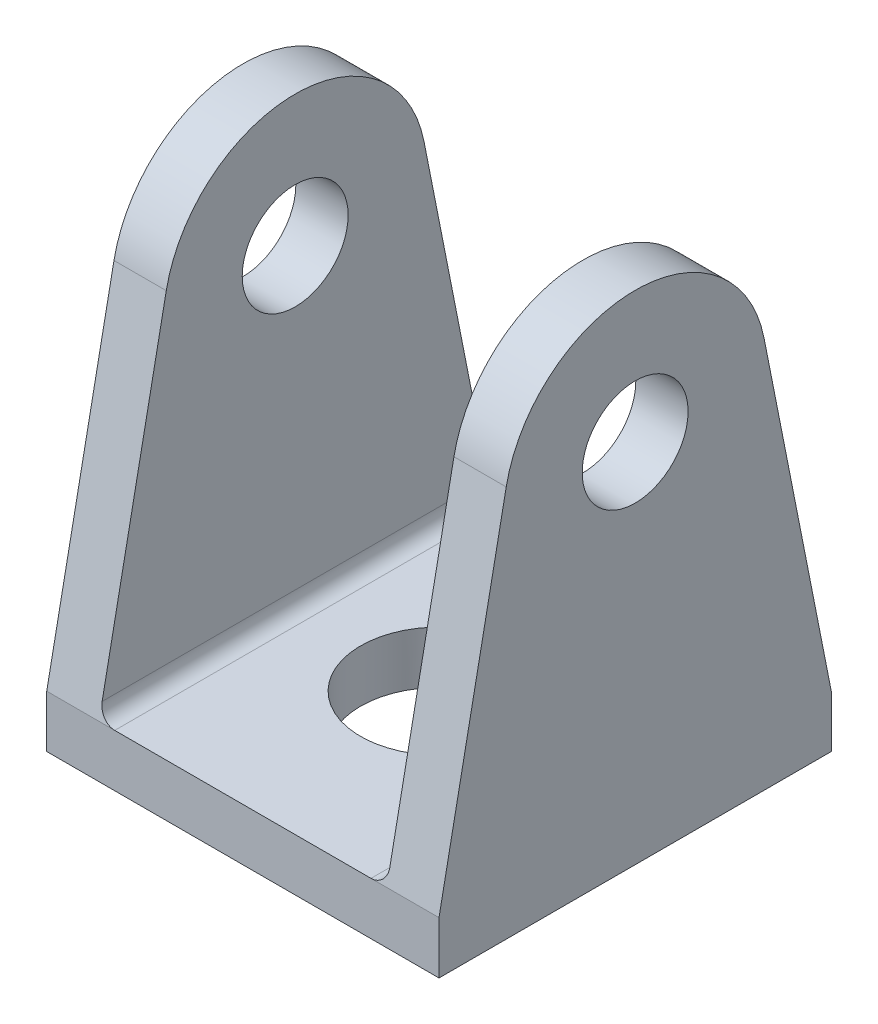
ISO-10303-21;
HEADER;
FILE_DESCRIPTION(('STEP AP214'),'2;1');
FILE_NAME('part.step','',(''),(''),'','','');
FILE_SCHEMA(('AUTOMOTIVE_DESIGN { 1 0 10303 214 1 1 1 1 }'));
ENDSEC;
DATA;
#1=APPLICATION_CONTEXT('core data for automotive mechanical design processes');
#2=APPLICATION_PROTOCOL_DEFINITION('international standard','automotive_design',2000,#1);
#3=PRODUCT_CONTEXT('',#1,'mechanical');
#4=PRODUCT('Part','Part','',(#3));
#5=PRODUCT_RELATED_PRODUCT_CATEGORY('part','',(#4));
#6=PRODUCT_DEFINITION_FORMATION('','',#4);
#7=PRODUCT_DEFINITION_CONTEXT('part definition',#1,'design');
#8=PRODUCT_DEFINITION('design','',#6,#7);
#9=PRODUCT_DEFINITION_SHAPE('','',#8);
#10=(LENGTH_UNIT() NAMED_UNIT(*) SI_UNIT(.MILLI.,.METRE.));
#11=(NAMED_UNIT(*) PLANE_ANGLE_UNIT() SI_UNIT($,.RADIAN.));
#12=(NAMED_UNIT(*) SI_UNIT($,.STERADIAN.) SOLID_ANGLE_UNIT());
#13=UNCERTAINTY_MEASURE_WITH_UNIT(LENGTH_MEASURE(1.E-05),#10,'distance_accuracy_value','');
#14=(GEOMETRIC_REPRESENTATION_CONTEXT(3) GLOBAL_UNCERTAINTY_ASSIGNED_CONTEXT((#13)) GLOBAL_UNIT_ASSIGNED_CONTEXT((#10,
#11,#12)) REPRESENTATION_CONTEXT('',''));
#15=CARTESIAN_POINT('',(0.,0.,0.));
#16=DIRECTION('',(0.,0.,1.));
#17=DIRECTION('',(1.,0.,0.));
#18=AXIS2_PLACEMENT_3D('',#15,#16,#17);
#19=CARTESIAN_POINT('',(-113.451600363327,74.8826559898735,-62.1459995837976));
#20=DIRECTION('',(0.,0.194334566761134,-0.980935306817816));
#21=DIRECTION('',(0.,0.980935306817816,0.194334566761134));
#22=AXIS2_PLACEMENT_3D('',#19,#20,#21);
#23=PLANE('',#22);
#24=DIRECTION('',(0.,0.980935306817816,0.194334566761134));
#25=VECTOR('',#24,1.);
#26=CARTESIAN_POINT('',(9.99999999999999,74.8826559898735,-62.1459995837976));
#27=LINE('',#26,#25);
#28=CARTESIAN_POINT('',(9.99999999999999,13.,-74.405665494726));
#29=VERTEX_POINT('',#28);
#30=CARTESIAN_POINT('',(9.99999999999999,74.8826559898735,-62.1459995837976));
#31=VERTEX_POINT('',#30);
#32=EDGE_CURVE('E98',#29,#31,#27,.T.);
#33=ORIENTED_EDGE('',*,*,#32,.F.);
#34=CARTESIAN_POINT('',(13.,13.,-74.405665494726));
#35=DIRECTION('',(0.,0.194334566761134,-0.980935306817816));
#36=DIRECTION('',(0.,-0.980935306817816,-0.194334566761134));
#37=AXIS2_PLACEMENT_3D('',#34,#35,#36);
#38=ELLIPSE('',#37,3.05830565904707,3.);
#39=CARTESIAN_POINT('',(13.,10.,-75.));
#40=VERTEX_POINT('',#39);
#41=EDGE_CURVE('E11',#29,#40,#38,.F.);
#42=ORIENTED_EDGE('',*,*,#41,.T.);
#43=DIRECTION('',(-1.,0.,0.));
#44=VECTOR('',#43,1.);
#45=CARTESIAN_POINT('',(0.,10.,-75.));
#46=LINE('',#45,#44);
#47=CARTESIAN_POINT('',(0.,9.99999999999998,-75.));
#48=VERTEX_POINT('',#47);
#49=EDGE_CURVE('E48',#40,#48,#46,.T.);
#50=ORIENTED_EDGE('',*,*,#49,.T.);
#51=DIRECTION('',(0.,-0.980935306817816,-0.194334566761134));
#52=VECTOR('',#51,1.);
#53=CARTESIAN_POINT('',(0.,74.8826559898735,-62.1459995837976));
#54=LINE('',#53,#52);
#55=CARTESIAN_POINT('',(0.,74.8826559898735,-62.1459995837976));
#56=VERTEX_POINT('',#55);
#57=EDGE_CURVE('E158',#56,#48,#54,.T.);
#58=ORIENTED_EDGE('',*,*,#57,.F.);
#59=DIRECTION('',(1.,0.,0.));
#60=VECTOR('',#59,1.);
#61=CARTESIAN_POINT('',(-113.451600363327,74.8826559898735,-62.1459995837976));
#62=LINE('',#61,#60);
#63=EDGE_CURVE('E111',#56,#31,#62,.T.);
#64=ORIENTED_EDGE('',*,*,#63,.T.);
#65=EDGE_LOOP('',(#33,#42,#50,#58,#64));
#66=FACE_BOUND('',#65,.T.);
#67=ADVANCED_FACE('F33',(#66),#23,.T.);
#68=CARTESIAN_POINT('',(-113.451600363327,70.,-37.5));
#69=DIRECTION('',(1.,0.,0.));
#70=DIRECTION('',(0.,0.,-1.));
#71=AXIS2_PLACEMENT_3D('',#68,#69,#70);
#72=CYLINDRICAL_SURFACE('',#71,25.125);
#73=CARTESIAN_POINT('',(9.99999999999999,70.,-37.5));
#74=DIRECTION('',(-1.,0.,0.));
#75=DIRECTION('',(0.,0.,1.));
#76=AXIS2_PLACEMENT_3D('',#73,#74,#75);
#77=CIRCLE('',#76,25.125);
#78=CARTESIAN_POINT('',(9.99999999999999,74.8826559898735,-12.8540004162024));
#79=VERTEX_POINT('',#78);
#80=EDGE_CURVE('E113',#31,#79,#77,.F.);
#81=ORIENTED_EDGE('',*,*,#80,.F.);
#82=ORIENTED_EDGE('',*,*,#63,.F.);
#83=CARTESIAN_POINT('',(0.,70.,-37.5));
#84=DIRECTION('',(1.,0.,0.));
#85=DIRECTION('',(0.,0.,-1.));
#86=AXIS2_PLACEMENT_3D('',#83,#84,#85);
#87=CIRCLE('',#86,25.125);
#88=CARTESIAN_POINT('',(0.,74.8826559898735,-12.8540004162024));
#89=VERTEX_POINT('',#88);
#90=EDGE_CURVE('E142',#89,#56,#87,.F.);
#91=ORIENTED_EDGE('',*,*,#90,.F.);
#92=DIRECTION('',(1.,0.,0.));
#93=VECTOR('',#92,1.);
#94=CARTESIAN_POINT('',(-113.451600363327,74.8826559898735,-12.8540004162024));
#95=LINE('',#94,#93);
#96=EDGE_CURVE('E133',#89,#79,#95,.T.);
#97=ORIENTED_EDGE('',*,*,#96,.T.);
#98=EDGE_LOOP('',(#81,#82,#91,#97));
#99=FACE_BOUND('',#98,.T.);
#100=ADVANCED_FACE('F140',(#99),#72,.T.);
#101=CARTESIAN_POINT('',(-113.451600363327,10.,0.));
#102=DIRECTION('',(0.,0.194334566761134,0.980935306817816));
#103=DIRECTION('',(0.,-0.980935306817816,0.194334566761134));
#104=AXIS2_PLACEMENT_3D('',#101,#102,#103);
#105=PLANE('',#104);
#106=DIRECTION('',(0.,-0.980935306817816,0.194334566761134));
#107=VECTOR('',#106,1.);
#108=CARTESIAN_POINT('',(9.99999999999999,10.,0.));
#109=LINE('',#108,#107);
#110=CARTESIAN_POINT('',(9.99999999999999,13.,-0.594334505274052));
#111=VERTEX_POINT('',#110);
#112=EDGE_CURVE('E101',#79,#111,#109,.T.);
#113=ORIENTED_EDGE('',*,*,#112,.F.);
#114=ORIENTED_EDGE('',*,*,#96,.F.);
#115=DIRECTION('',(0.,0.980935306817816,-0.194334566761134));
#116=VECTOR('',#115,1.);
#117=CARTESIAN_POINT('',(0.,10.,0.));
#118=LINE('',#117,#116);
#119=CARTESIAN_POINT('',(0.,10.,0.));
#120=VERTEX_POINT('',#119);
#121=EDGE_CURVE('E145',#120,#89,#118,.T.);
#122=ORIENTED_EDGE('',*,*,#121,.F.);
#123=DIRECTION('',(1.,0.,0.));
#124=VECTOR('',#123,1.);
#125=CARTESIAN_POINT('',(0.,10.,0.));
#126=LINE('',#125,#124);
#127=CARTESIAN_POINT('',(13.,10.,0.));
#128=VERTEX_POINT('',#127);
#129=EDGE_CURVE('E72',#120,#128,#126,.T.);
#130=ORIENTED_EDGE('',*,*,#129,.T.);
#131=CARTESIAN_POINT('',(13.,13.,-0.594334505274061));
#132=DIRECTION('',(0.,0.194334566761134,0.980935306817816));
#133=DIRECTION('',(0.,0.980935306817816,-0.194334566761134));
#134=AXIS2_PLACEMENT_3D('',#131,#132,#133);
#135=ELLIPSE('',#134,3.05830565904707,3.);
#136=EDGE_CURVE('E41',#128,#111,#135,.F.);
#137=ORIENTED_EDGE('',*,*,#136,.T.);
#138=EDGE_LOOP('',(#113,#114,#122,#130,#137));
#139=FACE_BOUND('',#138,.T.);
#140=ADVANCED_FACE('F128',(#139),#105,.T.);
#141=CARTESIAN_POINT('',(-113.451600363327,70.,-37.5));
#142=DIRECTION('',(1.,0.,0.));
#143=DIRECTION('',(0.,0.,-1.));
#144=AXIS2_PLACEMENT_3D('',#141,#142,#143);
#145=CYLINDRICAL_SURFACE('',#144,10.125);
#146=CARTESIAN_POINT('',(9.99999999999999,70.,-37.5));
#147=DIRECTION('',(-1.,0.,0.));
#148=DIRECTION('',(0.,0.,1.));
#149=AXIS2_PLACEMENT_3D('',#146,#147,#148);
#150=CIRCLE('',#149,10.125);
#151=CARTESIAN_POINT('',(9.99999999999999,70.,-27.375));
#152=VERTEX_POINT('',#151);
#153=EDGE_CURVE('E136',#152,#152,#150,.F.);
#154=ORIENTED_EDGE('',*,*,#153,.T.);
#155=EDGE_LOOP('',(#154));
#156=FACE_BOUND('',#155,.T.);
#157=CARTESIAN_POINT('',(0.,70.,-37.5));
#158=DIRECTION('',(1.,0.,0.));
#159=DIRECTION('',(0.,0.,-1.));
#160=AXIS2_PLACEMENT_3D('',#157,#158,#159);
#161=CIRCLE('',#160,10.125);
#162=CARTESIAN_POINT('',(0.,70.,-47.625));
#163=VERTEX_POINT('',#162);
#164=EDGE_CURVE('E154',#163,#163,#161,.F.);
#165=ORIENTED_EDGE('',*,*,#164,.T.);
#166=EDGE_LOOP('',(#165));
#167=FACE_BOUND('',#166,.T.);
#168=ADVANCED_FACE('F315',(#156,#167),#145,.F.);
#169=CARTESIAN_POINT('',(0.,0.,0.));
#170=DIRECTION('',(0.,-1.,0.));
#171=DIRECTION('',(0.,0.,-1.));
#172=AXIS2_PLACEMENT_3D('',#169,#170,#171);
#173=PLANE('',#172);
#174=DIRECTION('',(0.,0.,1.));
#175=VECTOR('',#174,1.);
#176=CARTESIAN_POINT('',(0.,0.,0.));
#177=LINE('',#176,#175);
#178=CARTESIAN_POINT('',(0.,0.,-75.));
#179=VERTEX_POINT('',#178);
#180=CARTESIAN_POINT('',(0.,0.,0.));
#181=VERTEX_POINT('',#180);
#182=EDGE_CURVE('E161',#179,#181,#177,.T.);
#183=ORIENTED_EDGE('',*,*,#182,.F.);
#184=DIRECTION('',(-1.,0.,0.));
#185=VECTOR('',#184,1.);
#186=CARTESIAN_POINT('',(0.,0.,-75.));
#187=LINE('',#186,#185);
#188=CARTESIAN_POINT('',(75.,0.,-75.));
#189=VERTEX_POINT('',#188);
#190=EDGE_CURVE('E174',#189,#179,#187,.T.);
#191=ORIENTED_EDGE('',*,*,#190,.F.);
#192=DIRECTION('',(0.,0.,-1.));
#193=VECTOR('',#192,1.);
#194=CARTESIAN_POINT('',(75.,0.,0.));
#195=LINE('',#194,#193);
#196=CARTESIAN_POINT('',(75.,0.,0.));
#197=VERTEX_POINT('',#196);
#198=EDGE_CURVE('E171',#197,#189,#195,.T.);
#199=ORIENTED_EDGE('',*,*,#198,.F.);
#200=DIRECTION('',(1.,0.,0.));
#201=VECTOR('',#200,1.);
#202=CARTESIAN_POINT('',(0.,0.,0.));
#203=LINE('',#202,#201);
#204=EDGE_CURVE('E168',#181,#197,#203,.T.);
#205=ORIENTED_EDGE('',*,*,#204,.F.);
#206=EDGE_LOOP('',(#183,#191,#199,#205));
#207=FACE_BOUND('',#206,.T.);
#208=CARTESIAN_POINT('',(37.5,0.,-37.5));
#209=DIRECTION('',(0.,1.,0.));
#210=DIRECTION('',(0.,0.,1.));
#211=AXIS2_PLACEMENT_3D('',#208,#209,#210);
#212=CIRCLE('',#211,15.);
#213=CARTESIAN_POINT('',(37.5,0.,-22.5));
#214=VERTEX_POINT('',#213);
#215=EDGE_CURVE('E157',#214,#214,#212,.T.);
#216=ORIENTED_EDGE('',*,*,#215,.T.);
#217=EDGE_LOOP('',(#216));
#218=FACE_BOUND('',#217,.T.);
#219=ADVANCED_FACE('F282',(#207,#218),#173,.T.);
#220=CARTESIAN_POINT('',(0.,10.,0.));
#221=DIRECTION('',(1.,0.,0.));
#222=DIRECTION('',(0.,0.,-1.));
#223=AXIS2_PLACEMENT_3D('',#220,#221,#222);
#224=PLANE('',#223);
#225=ORIENTED_EDGE('',*,*,#182,.T.);
#226=DIRECTION('',(0.,-1.,0.));
#227=VECTOR('',#226,1.);
#228=CARTESIAN_POINT('',(0.,10.,0.));
#229=LINE('',#228,#227);
#230=EDGE_CURVE('E122',#120,#181,#229,.T.);
#231=ORIENTED_EDGE('',*,*,#230,.F.);
#232=ORIENTED_EDGE('',*,*,#121,.T.);
#233=ORIENTED_EDGE('',*,*,#90,.T.);
#234=ORIENTED_EDGE('',*,*,#57,.T.);
#235=DIRECTION('',(0.,-1.,0.));
#236=VECTOR('',#235,1.);
#237=CARTESIAN_POINT('',(0.,10.,-75.));
#238=LINE('',#237,#236);
#239=EDGE_CURVE('E165',#48,#179,#238,.T.);
#240=ORIENTED_EDGE('',*,*,#239,.T.);
#241=EDGE_LOOP('',(#225,#231,#232,#233,#234,#240));
#242=FACE_BOUND('',#241,.T.);
#243=ORIENTED_EDGE('',*,*,#164,.F.);
#244=EDGE_LOOP('',(#243));
#245=FACE_BOUND('',#244,.T.);
#246=ADVANCED_FACE('F279',(#242,#245),#224,.F.);
#247=CARTESIAN_POINT('',(0.,10.,0.));
#248=DIRECTION('',(0.,0.,-1.));
#249=DIRECTION('',(-1.,0.,0.));
#250=AXIS2_PLACEMENT_3D('',#247,#248,#249);
#251=PLANE('',#250);
#252=ORIENTED_EDGE('',*,*,#204,.T.);
#253=DIRECTION('',(0.,-1.,0.));
#254=VECTOR('',#253,1.);
#255=CARTESIAN_POINT('',(75.,10.,0.));
#256=LINE('',#255,#254);
#257=CARTESIAN_POINT('',(75.,10.,0.));
#258=VERTEX_POINT('',#257);
#259=EDGE_CURVE('E182',#258,#197,#256,.T.);
#260=ORIENTED_EDGE('',*,*,#259,.F.);
#261=CARTESIAN_POINT('',(62.,10.,0.));
#262=VERTEX_POINT('',#261);
#263=EDGE_CURVE('E57',#262,#258,#126,.T.);
#264=ORIENTED_EDGE('',*,*,#263,.F.);
#265=DIRECTION('',(1.,0.,0.));
#266=VECTOR('',#265,1.);
#267=CARTESIAN_POINT('',(10.,10.,0.));
#268=LINE('',#267,#266);
#269=EDGE_CURVE('E246',#128,#262,#268,.T.);
#270=ORIENTED_EDGE('',*,*,#269,.F.);
#271=ORIENTED_EDGE('',*,*,#129,.F.);
#272=ORIENTED_EDGE('',*,*,#230,.T.);
#273=EDGE_LOOP('',(#252,#260,#264,#270,#271,#272));
#274=FACE_BOUND('',#273,.T.);
#275=ADVANCED_FACE('F284',(#274),#251,.F.);
#276=CARTESIAN_POINT('',(75.,10.,0.));
#277=DIRECTION('',(-1.,0.,0.));
#278=DIRECTION('',(0.,0.,1.));
#279=AXIS2_PLACEMENT_3D('',#276,#277,#278);
#280=PLANE('',#279);
#281=ORIENTED_EDGE('',*,*,#198,.T.);
#282=DIRECTION('',(0.,-1.,0.));
#283=VECTOR('',#282,1.);
#284=CARTESIAN_POINT('',(75.,10.,-75.));
#285=LINE('',#284,#283);
#286=CARTESIAN_POINT('',(75.,10.,-75.));
#287=VERTEX_POINT('',#286);
#288=EDGE_CURVE('E179',#287,#189,#285,.T.);
#289=ORIENTED_EDGE('',*,*,#288,.F.);
#290=DIRECTION('',(0.,0.980935306817816,0.194334566761134));
#291=VECTOR('',#290,1.);
#292=CARTESIAN_POINT('',(75.,74.8826559898735,-62.1459995837976));
#293=LINE('',#292,#291);
#294=CARTESIAN_POINT('',(75.,74.8826559898735,-62.1459995837976));
#295=VERTEX_POINT('',#294);
#296=EDGE_CURVE('E214',#287,#295,#293,.T.);
#297=ORIENTED_EDGE('',*,*,#296,.T.);
#298=CARTESIAN_POINT('',(75.,70.,-37.5));
#299=DIRECTION('',(1.,0.,0.));
#300=DIRECTION('',(0.,0.,-1.));
#301=AXIS2_PLACEMENT_3D('',#298,#299,#300);
#302=CIRCLE('',#301,25.125);
#303=CARTESIAN_POINT('',(75.,74.8826559898735,-12.8540004162024));
#304=VERTEX_POINT('',#303);
#305=EDGE_CURVE('E216',#295,#304,#302,.T.);
#306=ORIENTED_EDGE('',*,*,#305,.T.);
#307=DIRECTION('',(0.,-0.980935306817816,0.194334566761134));
#308=VECTOR('',#307,1.);
#309=CARTESIAN_POINT('',(75.,10.,0.));
#310=LINE('',#309,#308);
#311=EDGE_CURVE('E150',#304,#258,#310,.T.);
#312=ORIENTED_EDGE('',*,*,#311,.T.);
#313=ORIENTED_EDGE('',*,*,#259,.T.);
#314=EDGE_LOOP('',(#281,#289,#297,#306,#312,#313));
#315=FACE_BOUND('',#314,.T.);
#316=CARTESIAN_POINT('',(75.,70.,-37.5));
#317=DIRECTION('',(1.,0.,0.));
#318=DIRECTION('',(0.,0.,-1.));
#319=AXIS2_PLACEMENT_3D('',#316,#317,#318);
#320=CIRCLE('',#319,10.125);
#321=CARTESIAN_POINT('',(75.,70.,-47.625));
#322=VERTEX_POINT('',#321);
#323=EDGE_CURVE('E207',#322,#322,#320,.T.);
#324=ORIENTED_EDGE('',*,*,#323,.F.);
#325=EDGE_LOOP('',(#324));
#326=FACE_BOUND('',#325,.T.);
#327=ADVANCED_FACE('F236',(#315,#326),#280,.F.);
#328=CARTESIAN_POINT('',(0.,10.,-75.));
#329=DIRECTION('',(0.,0.,1.));
#330=DIRECTION('',(1.,0.,0.));
#331=AXIS2_PLACEMENT_3D('',#328,#329,#330);
#332=PLANE('',#331);
#333=ORIENTED_EDGE('',*,*,#190,.T.);
#334=ORIENTED_EDGE('',*,*,#239,.F.);
#335=ORIENTED_EDGE('',*,*,#49,.F.);
#336=DIRECTION('',(1.,0.,0.));
#337=VECTOR('',#336,1.);
#338=CARTESIAN_POINT('',(10.,10.,-75.));
#339=LINE('',#338,#337);
#340=CARTESIAN_POINT('',(62.,10.,-75.));
#341=VERTEX_POINT('',#340);
#342=EDGE_CURVE('E190',#40,#341,#339,.T.);
#343=ORIENTED_EDGE('',*,*,#342,.T.);
#344=EDGE_CURVE('E163',#287,#341,#46,.T.);
#345=ORIENTED_EDGE('',*,*,#344,.F.);
#346=ORIENTED_EDGE('',*,*,#288,.T.);
#347=EDGE_LOOP('',(#333,#334,#335,#343,#345,#346));
#348=FACE_BOUND('',#347,.T.);
#349=ADVANCED_FACE('F243',(#348),#332,.F.);
#350=CARTESIAN_POINT('',(37.5,10.,-37.5));
#351=DIRECTION('',(0.,-1.,0.));
#352=DIRECTION('',(0.,0.,-1.));
#353=AXIS2_PLACEMENT_3D('',#350,#351,#352);
#354=CYLINDRICAL_SURFACE('',#353,15.);
#355=CARTESIAN_POINT('',(37.5,10.,-37.5));
#356=DIRECTION('',(0.,-1.,0.));
#357=DIRECTION('',(0.,0.,-1.));
#358=AXIS2_PLACEMENT_3D('',#355,#356,#357);
#359=CIRCLE('',#358,15.);
#360=CARTESIAN_POINT('',(37.5,10.,-52.5));
#361=VERTEX_POINT('',#360);
#362=EDGE_CURVE('E112',#361,#361,#359,.T.);
#363=ORIENTED_EDGE('',*,*,#362,.F.);
#364=EDGE_LOOP('',(#363));
#365=FACE_BOUND('',#364,.T.);
#366=ORIENTED_EDGE('',*,*,#215,.F.);
#367=EDGE_LOOP('',(#366));
#368=FACE_BOUND('',#367,.T.);
#369=ADVANCED_FACE('F301',(#365,#368),#354,.F.);
#370=DIRECTION('',(0.,-0.980935306817816,-0.194334566761134));
#371=VECTOR('',#370,1.);
#372=CARTESIAN_POINT('',(65.,74.8826559898735,-62.1459995837976));
#373=LINE('',#372,#371);
#374=CARTESIAN_POINT('',(65.,74.8826559898735,-62.1459995837976));
#375=VERTEX_POINT('',#374);
#376=CARTESIAN_POINT('',(65.,13.,-74.405665494726));
#377=VERTEX_POINT('',#376);
#378=EDGE_CURVE('E192',#375,#377,#373,.T.);
#379=ORIENTED_EDGE('',*,*,#378,.F.);
#380=EDGE_CURVE('E153',#375,#295,#62,.T.);
#381=ORIENTED_EDGE('',*,*,#380,.T.);
#382=ORIENTED_EDGE('',*,*,#296,.F.);
#383=ORIENTED_EDGE('',*,*,#344,.T.);
#384=CARTESIAN_POINT('',(62.,13.,-74.405665494726));
#385=DIRECTION('',(0.,0.194334566761134,-0.980935306817816));
#386=DIRECTION('',(0.,-0.980935306817816,-0.194334566761134));
#387=AXIS2_PLACEMENT_3D('',#384,#385,#386);
#388=ELLIPSE('',#387,3.05830565904707,3.);
#389=EDGE_CURVE('E127',#341,#377,#388,.F.);
#390=ORIENTED_EDGE('',*,*,#389,.T.);
#391=EDGE_LOOP('',(#379,#381,#382,#383,#390));
#392=FACE_BOUND('',#391,.T.);
#393=ADVANCED_FACE('F229',(#392),#23,.T.);
#394=CARTESIAN_POINT('',(65.,70.,-37.5));
#395=DIRECTION('',(1.,0.,0.));
#396=DIRECTION('',(0.,0.,-1.));
#397=AXIS2_PLACEMENT_3D('',#394,#395,#396);
#398=CIRCLE('',#397,25.125);
#399=CARTESIAN_POINT('',(65.,74.8826559898735,-12.8540004162024));
#400=VERTEX_POINT('',#399);
#401=EDGE_CURVE('E196',#400,#375,#398,.F.);
#402=ORIENTED_EDGE('',*,*,#401,.F.);
#403=EDGE_CURVE('E143',#400,#304,#95,.T.);
#404=ORIENTED_EDGE('',*,*,#403,.T.);
#405=ORIENTED_EDGE('',*,*,#305,.F.);
#406=ORIENTED_EDGE('',*,*,#380,.F.);
#407=EDGE_LOOP('',(#402,#404,#405,#406));
#408=FACE_BOUND('',#407,.T.);
#409=ADVANCED_FACE('F233',(#408),#72,.T.);
#410=DIRECTION('',(0.,0.980935306817816,-0.194334566761134));
#411=VECTOR('',#410,1.);
#412=CARTESIAN_POINT('',(65.,10.,0.));
#413=LINE('',#412,#411);
#414=CARTESIAN_POINT('',(65.,13.,-0.594334505274052));
#415=VERTEX_POINT('',#414);
#416=EDGE_CURVE('E189',#415,#400,#413,.T.);
#417=ORIENTED_EDGE('',*,*,#416,.F.);
#418=CARTESIAN_POINT('',(62.,13.,-0.594334505274061));
#419=DIRECTION('',(0.,0.194334566761134,0.980935306817816));
#420=DIRECTION('',(0.,0.980935306817816,-0.194334566761134));
#421=AXIS2_PLACEMENT_3D('',#418,#419,#420);
#422=ELLIPSE('',#421,3.05830565904707,3.);
#423=EDGE_CURVE('E81',#415,#262,#422,.F.);
#424=ORIENTED_EDGE('',*,*,#423,.T.);
#425=ORIENTED_EDGE('',*,*,#263,.T.);
#426=ORIENTED_EDGE('',*,*,#311,.F.);
#427=ORIENTED_EDGE('',*,*,#403,.F.);
#428=EDGE_LOOP('',(#417,#424,#425,#426,#427));
#429=FACE_BOUND('',#428,.T.);
#430=ADVANCED_FACE('F254',(#429),#105,.T.);
#431=CARTESIAN_POINT('',(65.,70.,-37.5));
#432=DIRECTION('',(1.,0.,0.));
#433=DIRECTION('',(0.,0.,-1.));
#434=AXIS2_PLACEMENT_3D('',#431,#432,#433);
#435=CIRCLE('',#434,10.125);
#436=CARTESIAN_POINT('',(65.,70.,-47.625));
#437=VERTEX_POINT('',#436);
#438=EDGE_CURVE('E187',#437,#437,#435,.F.);
#439=ORIENTED_EDGE('',*,*,#438,.T.);
#440=EDGE_LOOP('',(#439));
#441=FACE_BOUND('',#440,.T.);
#442=ORIENTED_EDGE('',*,*,#323,.T.);
#443=EDGE_LOOP('',(#442));
#444=FACE_BOUND('',#443,.T.);
#445=ADVANCED_FACE('F320',(#441,#444),#145,.F.);
#446=CARTESIAN_POINT('',(10.,10.,-75.));
#447=DIRECTION('',(-1.,0.,0.));
#448=DIRECTION('',(0.,0.,1.));
#449=AXIS2_PLACEMENT_3D('',#446,#447,#448);
#450=PLANE('',#449);
#451=ORIENTED_EDGE('',*,*,#112,.T.);
#452=DIRECTION('',(0.,0.,1.));
#453=VECTOR('',#452,1.);
#454=CARTESIAN_POINT('',(10.,13.,-75.));
#455=LINE('',#454,#453);
#456=EDGE_CURVE('E92',#111,#29,#455,.F.);
#457=ORIENTED_EDGE('',*,*,#456,.T.);
#458=ORIENTED_EDGE('',*,*,#32,.T.);
#459=ORIENTED_EDGE('',*,*,#80,.T.);
#460=EDGE_LOOP('',(#451,#457,#458,#459));
#461=FACE_BOUND('',#460,.T.);
#462=ORIENTED_EDGE('',*,*,#153,.F.);
#463=EDGE_LOOP('',(#462));
#464=FACE_BOUND('',#463,.T.);
#465=ADVANCED_FACE('F94',(#461,#464),#450,.F.);
#466=CARTESIAN_POINT('',(65.,10.,-75.));
#467=DIRECTION('',(1.,0.,0.));
#468=DIRECTION('',(0.,0.,-1.));
#469=AXIS2_PLACEMENT_3D('',#466,#467,#468);
#470=PLANE('',#469);
#471=ORIENTED_EDGE('',*,*,#378,.T.);
#472=DIRECTION('',(0.,0.,1.));
#473=VECTOR('',#472,1.);
#474=CARTESIAN_POINT('',(65.,13.,0.));
#475=LINE('',#474,#473);
#476=EDGE_CURVE('E118',#377,#415,#475,.T.);
#477=ORIENTED_EDGE('',*,*,#476,.T.);
#478=ORIENTED_EDGE('',*,*,#416,.T.);
#479=ORIENTED_EDGE('',*,*,#401,.T.);
#480=EDGE_LOOP('',(#471,#477,#478,#479));
#481=FACE_BOUND('',#480,.T.);
#482=ORIENTED_EDGE('',*,*,#438,.F.);
#483=EDGE_LOOP('',(#482));
#484=FACE_BOUND('',#483,.T.);
#485=ADVANCED_FACE('F250',(#481,#484),#470,.F.);
#486=CARTESIAN_POINT('',(10.,10.,-75.));
#487=DIRECTION('',(0.,-1.,0.));
#488=DIRECTION('',(0.,0.,-1.));
#489=AXIS2_PLACEMENT_3D('',#486,#487,#488);
#490=PLANE('',#489);
#491=ORIENTED_EDGE('',*,*,#362,.T.);
#492=EDGE_LOOP('',(#491));
#493=FACE_BOUND('',#492,.T.);
#494=ORIENTED_EDGE('',*,*,#269,.T.);
#495=DIRECTION('',(0.,0.,1.));
#496=VECTOR('',#495,1.);
#497=CARTESIAN_POINT('',(62.,10.,-75.));
#498=LINE('',#497,#496);
#499=EDGE_CURVE('E104',#262,#341,#498,.F.);
#500=ORIENTED_EDGE('',*,*,#499,.T.);
#501=ORIENTED_EDGE('',*,*,#342,.F.);
#502=DIRECTION('',(0.,0.,1.));
#503=VECTOR('',#502,1.);
#504=CARTESIAN_POINT('',(13.,10.,0.));
#505=LINE('',#504,#503);
#506=EDGE_CURVE('E116',#40,#128,#505,.T.);
#507=ORIENTED_EDGE('',*,*,#506,.T.);
#508=EDGE_LOOP('',(#494,#500,#501,#507));
#509=FACE_BOUND('',#508,.T.);
#510=ADVANCED_FACE('F245',(#493,#509),#490,.F.);
#511=CARTESIAN_POINT('',(62.,13.,-75.));
#512=DIRECTION('',(0.,0.,-1.));
#513=DIRECTION('',(-1.,0.,0.));
#514=AXIS2_PLACEMENT_3D('',#511,#512,#513);
#515=CYLINDRICAL_SURFACE('',#514,3.);
#516=ORIENTED_EDGE('',*,*,#389,.F.);
#517=ORIENTED_EDGE('',*,*,#499,.F.);
#518=ORIENTED_EDGE('',*,*,#423,.F.);
#519=ORIENTED_EDGE('',*,*,#476,.F.);
#520=EDGE_LOOP('',(#516,#517,#518,#519));
#521=FACE_BOUND('',#520,.T.);
#522=ADVANCED_FACE('F247',(#521),#515,.F.);
#523=CARTESIAN_POINT('',(13.,13.,-75.));
#524=DIRECTION('',(0.,0.,-1.));
#525=DIRECTION('',(-1.,0.,0.));
#526=AXIS2_PLACEMENT_3D('',#523,#524,#525);
#527=CYLINDRICAL_SURFACE('',#526,3.);
#528=ORIENTED_EDGE('',*,*,#41,.F.);
#529=ORIENTED_EDGE('',*,*,#456,.F.);
#530=ORIENTED_EDGE('',*,*,#136,.F.);
#531=ORIENTED_EDGE('',*,*,#506,.F.);
#532=EDGE_LOOP('',(#528,#529,#530,#531));
#533=FACE_BOUND('',#532,.T.);
#534=ADVANCED_FACE('F35',(#533),#527,.F.);
#535=CLOSED_SHELL('',(#67,#100,#140,#168,#219,#246,#275,#327,#349,#369,#393,#409,#430,#445,#465,
#485,#510,#522,#534));
#536=MANIFOLD_SOLID_BREP('B2',#535);
#537=ADVANCED_BREP_SHAPE_REPRESENTATION('',(#18,#536),#14);
#538=SHAPE_DEFINITION_REPRESENTATION(#9,#537);
ENDSEC;
END-ISO-10303-21;
